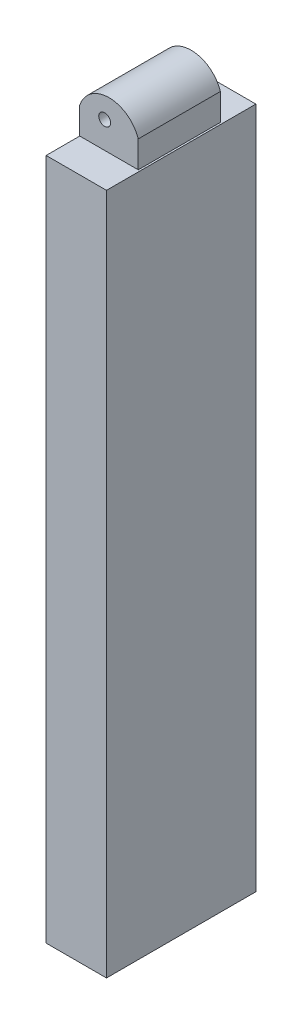
ISO-10303-21;
HEADER;
FILE_DESCRIPTION(('STEP AP214'),'2;1');
FILE_NAME('part.step','',(''),(''),'','','');
FILE_SCHEMA(('AUTOMOTIVE_DESIGN { 1 0 10303 214 1 1 1 1 }'));
ENDSEC;
DATA;
#1=APPLICATION_CONTEXT('core data for automotive mechanical design processes');
#2=APPLICATION_PROTOCOL_DEFINITION('international standard','automotive_design',2000,#1);
#3=PRODUCT_CONTEXT('',#1,'mechanical');
#4=PRODUCT('Part','Part','',(#3));
#5=PRODUCT_RELATED_PRODUCT_CATEGORY('part','',(#4));
#6=PRODUCT_DEFINITION_FORMATION('','',#4);
#7=PRODUCT_DEFINITION_CONTEXT('part definition',#1,'design');
#8=PRODUCT_DEFINITION('design','',#6,#7);
#9=PRODUCT_DEFINITION_SHAPE('','',#8);
#10=(LENGTH_UNIT() NAMED_UNIT(*) SI_UNIT(.MILLI.,.METRE.));
#11=(NAMED_UNIT(*) PLANE_ANGLE_UNIT() SI_UNIT($,.RADIAN.));
#12=(NAMED_UNIT(*) SI_UNIT($,.STERADIAN.) SOLID_ANGLE_UNIT());
#13=UNCERTAINTY_MEASURE_WITH_UNIT(LENGTH_MEASURE(1.E-05),#10,'distance_accuracy_value','');
#14=(GEOMETRIC_REPRESENTATION_CONTEXT(3) GLOBAL_UNCERTAINTY_ASSIGNED_CONTEXT((#13)) GLOBAL_UNIT_ASSIGNED_CONTEXT((#10,
#11,#12)) REPRESENTATION_CONTEXT('',''));
#15=CARTESIAN_POINT('',(0.,0.,0.));
#16=DIRECTION('',(0.,0.,1.));
#17=DIRECTION('',(1.,0.,0.));
#18=AXIS2_PLACEMENT_3D('',#15,#16,#17);
#19=CARTESIAN_POINT('',(9.4,62.8,-6.6));
#20=DIRECTION('',(0.,0.,1.));
#21=DIRECTION('',(1.,0.,0.));
#22=AXIS2_PLACEMENT_3D('',#19,#20,#21);
#23=PLANE('',#22);
#24=DIRECTION('',(0.,-1.,0.));
#25=VECTOR('',#24,1.);
#26=CARTESIAN_POINT('',(0.,62.8,-6.6));
#27=LINE('',#26,#25);
#28=CARTESIAN_POINT('',(0.,59.1,-6.6));
#29=VERTEX_POINT('',#28);
#30=CARTESIAN_POINT('',(0.,54.8,-6.6));
#31=VERTEX_POINT('',#30);
#32=EDGE_CURVE('E153',#29,#31,#27,.T.);
#33=ORIENTED_EDGE('',*,*,#32,.F.);
#34=CARTESIAN_POINT('',(4.7,57.5514705882353,-6.6));
#35=DIRECTION('',(0.,0.,1.));
#36=DIRECTION('',(1.,0.,0.));
#37=AXIS2_PLACEMENT_3D('',#34,#35,#36);
#38=CIRCLE('',#37,4.9485294117647);
#39=CARTESIAN_POINT('',(9.4,59.1,-6.6));
#40=VERTEX_POINT('',#39);
#41=EDGE_CURVE('E141',#29,#40,#38,.F.);
#42=ORIENTED_EDGE('',*,*,#41,.T.);
#43=DIRECTION('',(0.,-1.,0.));
#44=VECTOR('',#43,1.);
#45=CARTESIAN_POINT('',(9.4,62.8,-6.6));
#46=LINE('',#45,#44);
#47=CARTESIAN_POINT('',(9.4,54.8,-6.6));
#48=VERTEX_POINT('',#47);
#49=EDGE_CURVE('E139',#40,#48,#46,.T.);
#50=ORIENTED_EDGE('',*,*,#49,.T.);
#51=DIRECTION('',(-1.,0.,0.));
#52=VECTOR('',#51,1.);
#53=CARTESIAN_POINT('',(9.4,54.8,-6.6));
#54=LINE('',#53,#52);
#55=EDGE_CURVE('E155',#48,#31,#54,.T.);
#56=ORIENTED_EDGE('',*,*,#55,.T.);
#57=EDGE_LOOP('',(#33,#42,#50,#56));
#58=FACE_BOUND('',#57,.T.);
#59=CARTESIAN_POINT('',(4.,59.1,-6.6));
#60=DIRECTION('',(0.,0.,1.));
#61=DIRECTION('',(1.,0.,0.));
#62=AXIS2_PLACEMENT_3D('',#59,#60,#61);
#63=CIRCLE('',#62,0.949999999999998);
#64=CARTESIAN_POINT('',(4.95,59.1,-6.6));
#65=VERTEX_POINT('',#64);
#66=EDGE_CURVE('E259',#65,#65,#63,.T.);
#67=ORIENTED_EDGE('',*,*,#66,.T.);
#68=EDGE_LOOP('',(#67));
#69=FACE_BOUND('',#68,.T.);
#70=ADVANCED_FACE('F62',(#58,#69),#23,.F.);
#71=CARTESIAN_POINT('',(9.4,62.8,6.6));
#72=DIRECTION('',(0.,0.,-1.));
#73=DIRECTION('',(-1.,0.,0.));
#74=AXIS2_PLACEMENT_3D('',#71,#72,#73);
#75=PLANE('',#74);
#76=DIRECTION('',(0.,-1.,0.));
#77=VECTOR('',#76,1.);
#78=CARTESIAN_POINT('',(9.4,62.8,6.6));
#79=LINE('',#78,#77);
#80=CARTESIAN_POINT('',(9.4,59.1,6.6));
#81=VERTEX_POINT('',#80);
#82=CARTESIAN_POINT('',(9.4,54.8,6.6));
#83=VERTEX_POINT('',#82);
#84=EDGE_CURVE('E88',#81,#83,#79,.T.);
#85=ORIENTED_EDGE('',*,*,#84,.F.);
#86=CARTESIAN_POINT('',(4.7,57.5514705882353,6.6));
#87=DIRECTION('',(0.,0.,1.));
#88=DIRECTION('',(1.,0.,0.));
#89=AXIS2_PLACEMENT_3D('',#86,#87,#88);
#90=CIRCLE('',#89,4.9485294117647);
#91=CARTESIAN_POINT('',(0.,59.1,6.6));
#92=VERTEX_POINT('',#91);
#93=EDGE_CURVE('E128',#92,#81,#90,.F.);
#94=ORIENTED_EDGE('',*,*,#93,.F.);
#95=DIRECTION('',(0.,-1.,0.));
#96=VECTOR('',#95,1.);
#97=CARTESIAN_POINT('',(0.,62.8,6.6));
#98=LINE('',#97,#96);
#99=CARTESIAN_POINT('',(0.,54.8,6.6));
#100=VERTEX_POINT('',#99);
#101=EDGE_CURVE('E149',#92,#100,#98,.T.);
#102=ORIENTED_EDGE('',*,*,#101,.T.);
#103=DIRECTION('',(1.,0.,0.));
#104=VECTOR('',#103,1.);
#105=CARTESIAN_POINT('',(9.4,54.8,6.6));
#106=LINE('',#105,#104);
#107=EDGE_CURVE('E147',#100,#83,#106,.T.);
#108=ORIENTED_EDGE('',*,*,#107,.T.);
#109=EDGE_LOOP('',(#85,#94,#102,#108));
#110=FACE_BOUND('',#109,.T.);
#111=CARTESIAN_POINT('',(4.,59.1,6.6));
#112=DIRECTION('',(0.,0.,1.));
#113=DIRECTION('',(1.,0.,0.));
#114=AXIS2_PLACEMENT_3D('',#111,#112,#113);
#115=CIRCLE('',#114,0.949999999999998);
#116=CARTESIAN_POINT('',(4.95,59.1,6.6));
#117=VERTEX_POINT('',#116);
#118=EDGE_CURVE('E135',#117,#117,#115,.T.);
#119=ORIENTED_EDGE('',*,*,#118,.F.);
#120=EDGE_LOOP('',(#119));
#121=FACE_BOUND('',#120,.T.);
#122=ADVANCED_FACE('F144',(#110,#121),#75,.F.);
#123=CARTESIAN_POINT('',(9.7,54.8,-12.));
#124=DIRECTION('',(0.,-1.,0.));
#125=DIRECTION('',(0.,0.,-1.));
#126=AXIS2_PLACEMENT_3D('',#123,#124,#125);
#127=PLANE('',#126);
#128=ORIENTED_EDGE('',*,*,#107,.F.);
#129=DIRECTION('',(0.,0.,1.));
#130=VECTOR('',#129,1.);
#131=CARTESIAN_POINT('',(0.,54.8,-12.));
#132=LINE('',#131,#130);
#133=CARTESIAN_POINT('',(0.,54.8,12.));
#134=VERTEX_POINT('',#133);
#135=EDGE_CURVE('E186',#100,#134,#132,.T.);
#136=ORIENTED_EDGE('',*,*,#135,.T.);
#137=DIRECTION('',(-1.,0.,0.));
#138=VECTOR('',#137,1.);
#139=CARTESIAN_POINT('',(9.7,54.8,12.));
#140=LINE('',#139,#138);
#141=CARTESIAN_POINT('',(9.7,54.8,12.));
#142=VERTEX_POINT('',#141);
#143=EDGE_CURVE('E195',#142,#134,#140,.T.);
#144=ORIENTED_EDGE('',*,*,#143,.F.);
#145=DIRECTION('',(0.,0.,1.));
#146=VECTOR('',#145,1.);
#147=CARTESIAN_POINT('',(9.7,54.8,-12.));
#148=LINE('',#147,#146);
#149=CARTESIAN_POINT('',(9.7,54.8,-12.));
#150=VERTEX_POINT('',#149);
#151=EDGE_CURVE('E173',#150,#142,#148,.T.);
#152=ORIENTED_EDGE('',*,*,#151,.F.);
#153=DIRECTION('',(-1.,0.,0.));
#154=VECTOR('',#153,1.);
#155=CARTESIAN_POINT('',(9.7,54.8,-12.));
#156=LINE('',#155,#154);
#157=CARTESIAN_POINT('',(0.,54.8,-12.));
#158=VERTEX_POINT('',#157);
#159=EDGE_CURVE('E72',#150,#158,#156,.T.);
#160=ORIENTED_EDGE('',*,*,#159,.T.);
#161=EDGE_CURVE('E187',#158,#31,#132,.T.);
#162=ORIENTED_EDGE('',*,*,#161,.T.);
#163=ORIENTED_EDGE('',*,*,#55,.F.);
#164=DIRECTION('',(0.,0.,-1.));
#165=VECTOR('',#164,1.);
#166=CARTESIAN_POINT('',(9.4,54.8,6.6));
#167=LINE('',#166,#165);
#168=EDGE_CURVE('E261',#83,#48,#167,.T.);
#169=ORIENTED_EDGE('',*,*,#168,.F.);
#170=EDGE_LOOP('',(#128,#136,#144,#152,#160,#162,#163,#169));
#171=FACE_BOUND('',#170,.T.);
#172=ADVANCED_FACE('F218',(#171),#127,.F.);
#173=CARTESIAN_POINT('',(9.7,-54.8,-12.));
#174=DIRECTION('',(0.,-1.,0.));
#175=DIRECTION('',(0.,0.,-1.));
#176=AXIS2_PLACEMENT_3D('',#173,#174,#175);
#177=PLANE('',#176);
#178=DIRECTION('',(0.,0.,1.));
#179=VECTOR('',#178,1.);
#180=CARTESIAN_POINT('',(0.,-54.8,-12.));
#181=LINE('',#180,#179);
#182=CARTESIAN_POINT('',(0.,-54.8,-12.));
#183=VERTEX_POINT('',#182);
#184=CARTESIAN_POINT('',(0.,-54.8,12.));
#185=VERTEX_POINT('',#184);
#186=EDGE_CURVE('E163',#183,#185,#181,.T.);
#187=ORIENTED_EDGE('',*,*,#186,.F.);
#188=DIRECTION('',(-1.,0.,0.));
#189=VECTOR('',#188,1.);
#190=CARTESIAN_POINT('',(9.7,-54.8,-12.));
#191=LINE('',#190,#189);
#192=CARTESIAN_POINT('',(9.7,-54.8,-12.));
#193=VERTEX_POINT('',#192);
#194=EDGE_CURVE('E12',#193,#183,#191,.T.);
#195=ORIENTED_EDGE('',*,*,#194,.F.);
#196=DIRECTION('',(0.,0.,1.));
#197=VECTOR('',#196,1.);
#198=CARTESIAN_POINT('',(9.7,-54.8,-12.));
#199=LINE('',#198,#197);
#200=CARTESIAN_POINT('',(9.7,-54.8,12.));
#201=VERTEX_POINT('',#200);
#202=EDGE_CURVE('E164',#193,#201,#199,.T.);
#203=ORIENTED_EDGE('',*,*,#202,.T.);
#204=DIRECTION('',(-1.,0.,0.));
#205=VECTOR('',#204,1.);
#206=CARTESIAN_POINT('',(9.7,-54.8,12.));
#207=LINE('',#206,#205);
#208=EDGE_CURVE('E66',#201,#185,#207,.T.);
#209=ORIENTED_EDGE('',*,*,#208,.T.);
#210=EDGE_LOOP('',(#187,#195,#203,#209));
#211=FACE_BOUND('',#210,.T.);
#212=ADVANCED_FACE('F64',(#211),#177,.T.);
#213=CARTESIAN_POINT('',(9.7,-54.8,-12.));
#214=DIRECTION('',(0.,0.,1.));
#215=DIRECTION('',(1.,0.,0.));
#216=AXIS2_PLACEMENT_3D('',#213,#214,#215);
#217=PLANE('',#216);
#218=DIRECTION('',(0.,1.,0.));
#219=VECTOR('',#218,1.);
#220=CARTESIAN_POINT('',(0.,-54.8,-12.));
#221=LINE('',#220,#219);
#222=EDGE_CURVE('E169',#183,#158,#221,.T.);
#223=ORIENTED_EDGE('',*,*,#222,.T.);
#224=ORIENTED_EDGE('',*,*,#159,.F.);
#225=DIRECTION('',(0.,1.,0.));
#226=VECTOR('',#225,1.);
#227=CARTESIAN_POINT('',(9.7,-54.8,-12.));
#228=LINE('',#227,#226);
#229=EDGE_CURVE('E176',#193,#150,#228,.T.);
#230=ORIENTED_EDGE('',*,*,#229,.F.);
#231=ORIENTED_EDGE('',*,*,#194,.T.);
#232=EDGE_LOOP('',(#223,#224,#230,#231));
#233=FACE_BOUND('',#232,.T.);
#234=ADVANCED_FACE('F214',(#233),#217,.F.);
#235=CARTESIAN_POINT('',(9.7,-54.8,12.));
#236=DIRECTION('',(0.,0.,1.));
#237=DIRECTION('',(1.,0.,0.));
#238=AXIS2_PLACEMENT_3D('',#235,#236,#237);
#239=PLANE('',#238);
#240=DIRECTION('',(0.,1.,0.));
#241=VECTOR('',#240,1.);
#242=CARTESIAN_POINT('',(0.,-54.8,12.));
#243=LINE('',#242,#241);
#244=EDGE_CURVE('E182',#185,#134,#243,.T.);
#245=ORIENTED_EDGE('',*,*,#244,.F.);
#246=ORIENTED_EDGE('',*,*,#208,.F.);
#247=DIRECTION('',(0.,1.,0.));
#248=VECTOR('',#247,1.);
#249=CARTESIAN_POINT('',(9.7,-54.8,12.));
#250=LINE('',#249,#248);
#251=EDGE_CURVE('E168',#201,#142,#250,.T.);
#252=ORIENTED_EDGE('',*,*,#251,.T.);
#253=ORIENTED_EDGE('',*,*,#143,.T.);
#254=EDGE_LOOP('',(#245,#246,#252,#253));
#255=FACE_BOUND('',#254,.T.);
#256=ADVANCED_FACE('F206',(#255),#239,.T.);
#257=CARTESIAN_POINT('',(9.7,0.,0.));
#258=DIRECTION('',(-1.,0.,0.));
#259=DIRECTION('',(0.,0.,1.));
#260=AXIS2_PLACEMENT_3D('',#257,#258,#259);
#261=PLANE('',#260);
#262=ORIENTED_EDGE('',*,*,#202,.F.);
#263=ORIENTED_EDGE('',*,*,#229,.T.);
#264=ORIENTED_EDGE('',*,*,#151,.T.);
#265=ORIENTED_EDGE('',*,*,#251,.F.);
#266=EDGE_LOOP('',(#262,#263,#264,#265));
#267=FACE_BOUND('',#266,.T.);
#268=ADVANCED_FACE('F222',(#267),#261,.F.);
#269=CARTESIAN_POINT('',(0.,0.,0.));
#270=DIRECTION('',(-1.,0.,0.));
#271=DIRECTION('',(0.,0.,1.));
#272=AXIS2_PLACEMENT_3D('',#269,#270,#271);
#273=PLANE('',#272);
#274=DIRECTION('',(0.,0.,1.));
#275=VECTOR('',#274,1.);
#276=CARTESIAN_POINT('',(0.,59.1,-12.));
#277=LINE('',#276,#275);
#278=EDGE_CURVE('E80',#29,#92,#277,.T.);
#279=ORIENTED_EDGE('',*,*,#278,.F.);
#280=ORIENTED_EDGE('',*,*,#32,.T.);
#281=ORIENTED_EDGE('',*,*,#161,.F.);
#282=ORIENTED_EDGE('',*,*,#222,.F.);
#283=ORIENTED_EDGE('',*,*,#186,.T.);
#284=ORIENTED_EDGE('',*,*,#244,.T.);
#285=ORIENTED_EDGE('',*,*,#135,.F.);
#286=ORIENTED_EDGE('',*,*,#101,.F.);
#287=EDGE_LOOP('',(#279,#280,#281,#282,#283,#284,#285,#286));
#288=FACE_BOUND('',#287,.T.);
#289=ADVANCED_FACE('F210',(#288),#273,.T.);
#290=CARTESIAN_POINT('',(9.4,62.8,6.6));
#291=DIRECTION('',(-1.,0.,0.));
#292=DIRECTION('',(0.,0.,1.));
#293=AXIS2_PLACEMENT_3D('',#290,#291,#292);
#294=PLANE('',#293);
#295=ORIENTED_EDGE('',*,*,#49,.F.);
#296=DIRECTION('',(0.,0.,1.));
#297=VECTOR('',#296,1.);
#298=CARTESIAN_POINT('',(9.4,59.1,-12.));
#299=LINE('',#298,#297);
#300=EDGE_CURVE('E130',#40,#81,#299,.T.);
#301=ORIENTED_EDGE('',*,*,#300,.T.);
#302=ORIENTED_EDGE('',*,*,#84,.T.);
#303=ORIENTED_EDGE('',*,*,#168,.T.);
#304=EDGE_LOOP('',(#295,#301,#302,#303));
#305=FACE_BOUND('',#304,.T.);
#306=ADVANCED_FACE('F138',(#305),#294,.F.);
#307=CARTESIAN_POINT('',(4.7,57.5514705882353,-12.));
#308=DIRECTION('',(0.,0.,1.));
#309=DIRECTION('',(1.,0.,0.));
#310=AXIS2_PLACEMENT_3D('',#307,#308,#309);
#311=CYLINDRICAL_SURFACE('',#310,4.9485294117647);
#312=ORIENTED_EDGE('',*,*,#278,.T.);
#313=ORIENTED_EDGE('',*,*,#93,.T.);
#314=ORIENTED_EDGE('',*,*,#300,.F.);
#315=ORIENTED_EDGE('',*,*,#41,.F.);
#316=EDGE_LOOP('',(#312,#313,#314,#315));
#317=FACE_BOUND('',#316,.T.);
#318=ADVANCED_FACE('F129',(#317),#311,.T.);
#319=CARTESIAN_POINT('',(4.,59.1,-12.));
#320=DIRECTION('',(0.,0.,1.));
#321=DIRECTION('',(1.,0.,0.));
#322=AXIS2_PLACEMENT_3D('',#319,#320,#321);
#323=CYLINDRICAL_SURFACE('',#322,0.949999999999998);
#324=ORIENTED_EDGE('',*,*,#118,.T.);
#325=EDGE_LOOP('',(#324));
#326=FACE_BOUND('',#325,.T.);
#327=ORIENTED_EDGE('',*,*,#66,.F.);
#328=EDGE_LOOP('',(#327));
#329=FACE_BOUND('',#328,.T.);
#330=ADVANCED_FACE('F246',(#326,#329),#323,.F.);
#331=CLOSED_SHELL('',(#70,#122,#172,#212,#234,#256,#268,#289,#306,#318,#330));
#332=MANIFOLD_SOLID_BREP('B2',#331);
#333=ADVANCED_BREP_SHAPE_REPRESENTATION('',(#18,#332),#14);
#334=SHAPE_DEFINITION_REPRESENTATION(#9,#333);
ENDSEC;
END-ISO-10303-21;
